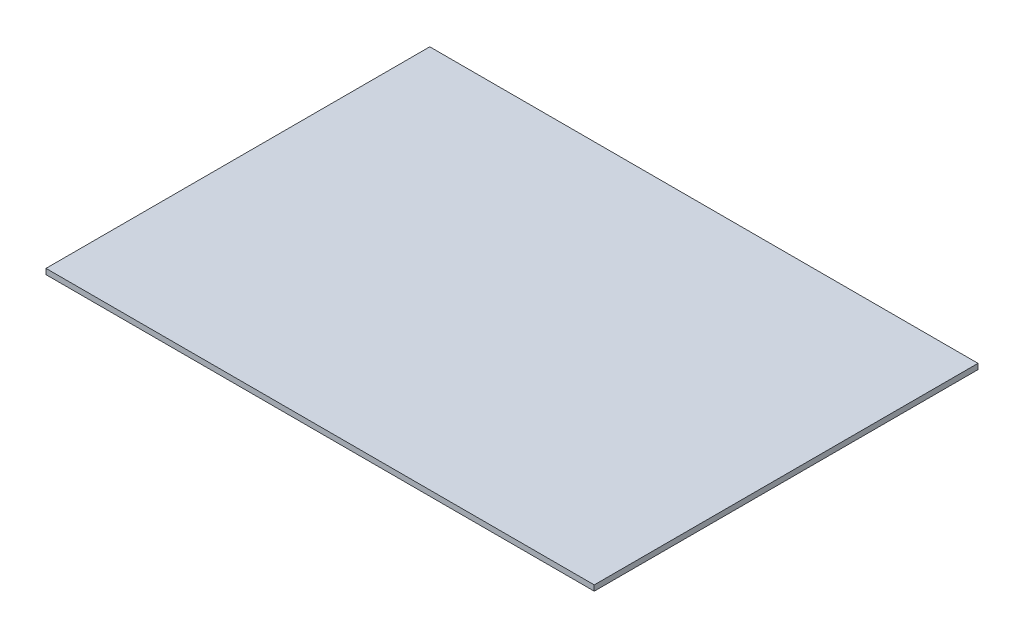
ISO-10303-21;
HEADER;
FILE_DESCRIPTION(('STEP AP214'),'2;1');
FILE_NAME('part.step','',(''),(''),'','','');
FILE_SCHEMA(('AUTOMOTIVE_DESIGN { 1 0 10303 214 1 1 1 1 }'));
ENDSEC;
DATA;
#1=APPLICATION_CONTEXT('core data for automotive mechanical design processes');
#2=APPLICATION_PROTOCOL_DEFINITION('international standard','automotive_design',2000,#1);
#3=PRODUCT_CONTEXT('',#1,'mechanical');
#4=PRODUCT('Part','Part','',(#3));
#5=PRODUCT_RELATED_PRODUCT_CATEGORY('part','',(#4));
#6=PRODUCT_DEFINITION_FORMATION('','',#4);
#7=PRODUCT_DEFINITION_CONTEXT('part definition',#1,'design');
#8=PRODUCT_DEFINITION('design','',#6,#7);
#9=PRODUCT_DEFINITION_SHAPE('','',#8);
#10=(LENGTH_UNIT() NAMED_UNIT(*) SI_UNIT(.MILLI.,.METRE.));
#11=(NAMED_UNIT(*) PLANE_ANGLE_UNIT() SI_UNIT($,.RADIAN.));
#12=(NAMED_UNIT(*) SI_UNIT($,.STERADIAN.) SOLID_ANGLE_UNIT());
#13=UNCERTAINTY_MEASURE_WITH_UNIT(LENGTH_MEASURE(1.E-05),#10,'distance_accuracy_value','');
#14=(GEOMETRIC_REPRESENTATION_CONTEXT(3) GLOBAL_UNCERTAINTY_ASSIGNED_CONTEXT((#13)) GLOBAL_UNIT_ASSIGNED_CONTEXT((#10,
#11,#12)) REPRESENTATION_CONTEXT('',''));
#15=CARTESIAN_POINT('',(0.,0.,0.));
#16=DIRECTION('',(0.,0.,1.));
#17=DIRECTION('',(1.,0.,0.));
#18=AXIS2_PLACEMENT_3D('',#15,#16,#17);
#19=CARTESIAN_POINT('',(-87.5162548764628,3.,124.759427828349));
#20=DIRECTION('',(0.,0.,-1.));
#21=DIRECTION('',(-1.,0.,0.));
#22=AXIS2_PLACEMENT_3D('',#19,#20,#21);
#23=PLANE('',#22);
#24=DIRECTION('',(1.,0.,0.));
#25=VECTOR('',#24,1.);
#26=CARTESIAN_POINT('',(-87.5162548764628,0.,124.759427828349));
#27=LINE('',#26,#25);
#28=CARTESIAN_POINT('',(-87.5162548764628,0.,124.759427828349));
#29=VERTEX_POINT('',#28);
#30=CARTESIAN_POINT('',(212.483745123537,0.,124.759427828349));
#31=VERTEX_POINT('',#30);
#32=EDGE_CURVE('E98',#29,#31,#27,.T.);
#33=ORIENTED_EDGE('',*,*,#32,.T.);
#34=DIRECTION('',(0.,-1.,0.));
#35=VECTOR('',#34,1.);
#36=CARTESIAN_POINT('',(212.483745123537,3.,124.759427828349));
#37=LINE('',#36,#35);
#38=CARTESIAN_POINT('',(212.483745123537,3.,124.759427828349));
#39=VERTEX_POINT('',#38);
#40=EDGE_CURVE('E11',#39,#31,#37,.T.);
#41=ORIENTED_EDGE('',*,*,#40,.F.);
#42=DIRECTION('',(1.,0.,0.));
#43=VECTOR('',#42,1.);
#44=CARTESIAN_POINT('',(-87.5162548764628,3.,124.759427828349));
#45=LINE('',#44,#43);
#46=CARTESIAN_POINT('',(-87.5162548764628,3.,124.759427828349));
#47=VERTEX_POINT('',#46);
#48=EDGE_CURVE('E75',#47,#39,#45,.T.);
#49=ORIENTED_EDGE('',*,*,#48,.F.);
#50=DIRECTION('',(0.,-1.,0.));
#51=VECTOR('',#50,1.);
#52=CARTESIAN_POINT('',(-87.5162548764628,3.,124.759427828349));
#53=LINE('',#52,#51);
#54=EDGE_CURVE('E94',#47,#29,#53,.T.);
#55=ORIENTED_EDGE('',*,*,#54,.T.);
#56=EDGE_LOOP('',(#33,#41,#49,#55));
#57=FACE_BOUND('',#56,.T.);
#58=ADVANCED_FACE('F36',(#57),#23,.F.);
#59=CARTESIAN_POINT('',(212.483745123537,3.,-85.2405721716515));
#60=DIRECTION('',(1.,0.,0.));
#61=DIRECTION('',(0.,0.,-1.));
#62=AXIS2_PLACEMENT_3D('',#59,#60,#61);
#63=PLANE('',#62);
#64=DIRECTION('',(0.,0.,1.));
#65=VECTOR('',#64,1.);
#66=CARTESIAN_POINT('',(212.483745123537,0.,-85.2405721716515));
#67=LINE('',#66,#65);
#68=CARTESIAN_POINT('',(212.483745123537,0.,-85.2405721716515));
#69=VERTEX_POINT('',#68);
#70=EDGE_CURVE('E84',#69,#31,#67,.T.);
#71=ORIENTED_EDGE('',*,*,#70,.F.);
#72=DIRECTION('',(0.,-1.,0.));
#73=VECTOR('',#72,1.);
#74=CARTESIAN_POINT('',(212.483745123537,3.,-85.2405721716515));
#75=LINE('',#74,#73);
#76=CARTESIAN_POINT('',(212.483745123537,3.,-85.2405721716515));
#77=VERTEX_POINT('',#76);
#78=EDGE_CURVE('E44',#77,#69,#75,.T.);
#79=ORIENTED_EDGE('',*,*,#78,.F.);
#80=DIRECTION('',(0.,0.,1.));
#81=VECTOR('',#80,1.);
#82=CARTESIAN_POINT('',(212.483745123537,3.,-85.2405721716515));
#83=LINE('',#82,#81);
#84=EDGE_CURVE('E82',#77,#39,#83,.T.);
#85=ORIENTED_EDGE('',*,*,#84,.T.);
#86=ORIENTED_EDGE('',*,*,#40,.T.);
#87=EDGE_LOOP('',(#71,#79,#85,#86));
#88=FACE_BOUND('',#87,.T.);
#89=ADVANCED_FACE('F81',(#88),#63,.T.);
#90=CARTESIAN_POINT('',(-87.5162548764629,3.,-85.2405721716515));
#91=DIRECTION('',(0.,0.,-1.));
#92=DIRECTION('',(-1.,0.,0.));
#93=AXIS2_PLACEMENT_3D('',#90,#91,#92);
#94=PLANE('',#93);
#95=DIRECTION('',(1.,0.,0.));
#96=VECTOR('',#95,1.);
#97=CARTESIAN_POINT('',(-87.5162548764629,0.,-85.2405721716515));
#98=LINE('',#97,#96);
#99=CARTESIAN_POINT('',(-87.5162548764629,0.,-85.2405721716515));
#100=VERTEX_POINT('',#99);
#101=EDGE_CURVE('E102',#100,#69,#98,.T.);
#102=ORIENTED_EDGE('',*,*,#101,.F.);
#103=DIRECTION('',(0.,-1.,0.));
#104=VECTOR('',#103,1.);
#105=CARTESIAN_POINT('',(-87.5162548764629,3.,-85.2405721716515));
#106=LINE('',#105,#104);
#107=CARTESIAN_POINT('',(-87.5162548764629,3.,-85.2405721716515));
#108=VERTEX_POINT('',#107);
#109=EDGE_CURVE('E67',#108,#100,#106,.T.);
#110=ORIENTED_EDGE('',*,*,#109,.F.);
#111=DIRECTION('',(1.,0.,0.));
#112=VECTOR('',#111,1.);
#113=CARTESIAN_POINT('',(-87.5162548764629,3.,-85.2405721716515));
#114=LINE('',#113,#112);
#115=EDGE_CURVE('E90',#108,#77,#114,.T.);
#116=ORIENTED_EDGE('',*,*,#115,.T.);
#117=ORIENTED_EDGE('',*,*,#78,.T.);
#118=EDGE_LOOP('',(#102,#110,#116,#117));
#119=FACE_BOUND('',#118,.T.);
#120=ADVANCED_FACE('F92',(#119),#94,.T.);
#121=CARTESIAN_POINT('',(-87.5162548764629,3.,-85.2405721716515));
#122=DIRECTION('',(1.,0.,0.));
#123=DIRECTION('',(0.,0.,-1.));
#124=AXIS2_PLACEMENT_3D('',#121,#122,#123);
#125=PLANE('',#124);
#126=DIRECTION('',(0.,0.,1.));
#127=VECTOR('',#126,1.);
#128=CARTESIAN_POINT('',(-87.5162548764629,0.,-85.2405721716515));
#129=LINE('',#128,#127);
#130=EDGE_CURVE('E70',#100,#29,#129,.T.);
#131=ORIENTED_EDGE('',*,*,#130,.T.);
#132=ORIENTED_EDGE('',*,*,#54,.F.);
#133=DIRECTION('',(0.,0.,1.));
#134=VECTOR('',#133,1.);
#135=CARTESIAN_POINT('',(-87.5162548764629,3.,-85.2405721716515));
#136=LINE('',#135,#134);
#137=EDGE_CURVE('E52',#108,#47,#136,.T.);
#138=ORIENTED_EDGE('',*,*,#137,.F.);
#139=ORIENTED_EDGE('',*,*,#109,.T.);
#140=EDGE_LOOP('',(#131,#132,#138,#139));
#141=FACE_BOUND('',#140,.T.);
#142=ADVANCED_FACE('F115',(#141),#125,.F.);
#143=CARTESIAN_POINT('',(0.,3.,0.));
#144=DIRECTION('',(0.,-1.,0.));
#145=DIRECTION('',(0.,0.,-1.));
#146=AXIS2_PLACEMENT_3D('',#143,#144,#145);
#147=PLANE('',#146);
#148=ORIENTED_EDGE('',*,*,#48,.T.);
#149=ORIENTED_EDGE('',*,*,#84,.F.);
#150=ORIENTED_EDGE('',*,*,#115,.F.);
#151=ORIENTED_EDGE('',*,*,#137,.T.);
#152=EDGE_LOOP('',(#148,#149,#150,#151));
#153=FACE_BOUND('',#152,.T.);
#154=ADVANCED_FACE('F89',(#153),#147,.F.);
#155=CARTESIAN_POINT('',(0.,0.,0.));
#156=DIRECTION('',(0.,-1.,0.));
#157=DIRECTION('',(0.,0.,-1.));
#158=AXIS2_PLACEMENT_3D('',#155,#156,#157);
#159=PLANE('',#158);
#160=ORIENTED_EDGE('',*,*,#32,.F.);
#161=ORIENTED_EDGE('',*,*,#130,.F.);
#162=ORIENTED_EDGE('',*,*,#101,.T.);
#163=ORIENTED_EDGE('',*,*,#70,.T.);
#164=EDGE_LOOP('',(#160,#161,#162,#163));
#165=FACE_BOUND('',#164,.T.);
#166=ADVANCED_FACE('F109',(#165),#159,.T.);
#167=CLOSED_SHELL('',(#58,#89,#120,#142,#154,#166));
#168=MANIFOLD_SOLID_BREP('B2',#167);
#169=ADVANCED_BREP_SHAPE_REPRESENTATION('',(#18,#168),#14);
#170=SHAPE_DEFINITION_REPRESENTATION(#9,#169);
ENDSEC;
END-ISO-10303-21;
